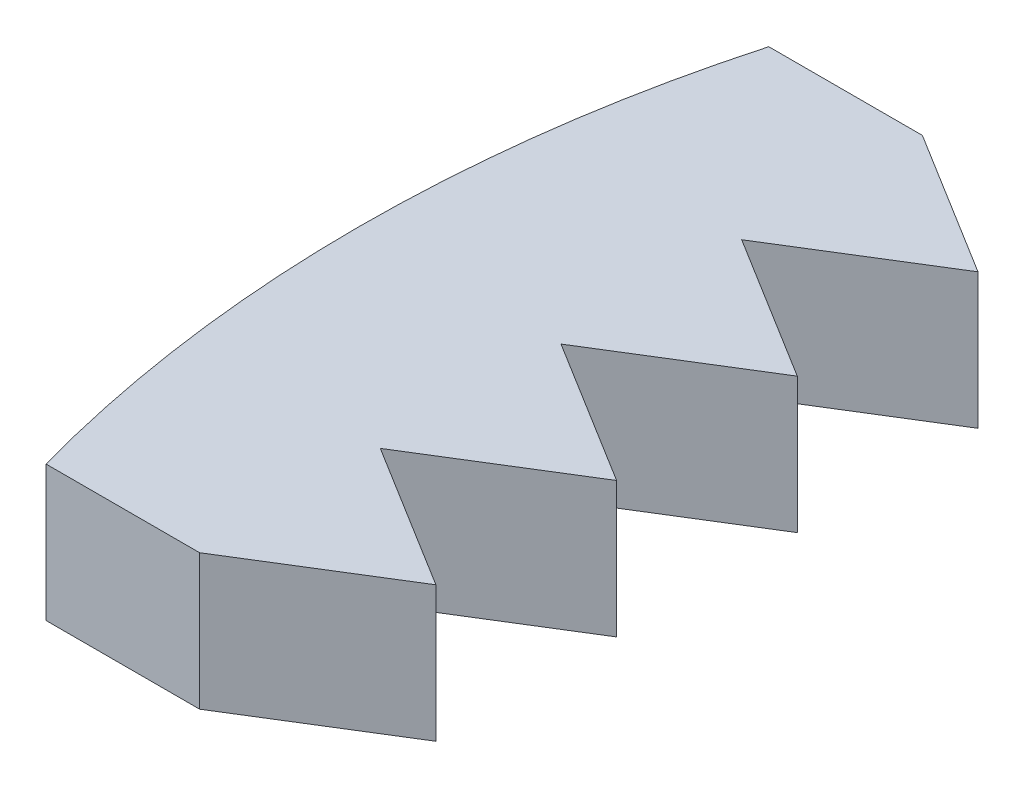
ISO-10303-21;
HEADER;
FILE_DESCRIPTION(('STEP AP214'),'2;1');
FILE_NAME('part.step','',(''),(''),'','','');
FILE_SCHEMA(('AUTOMOTIVE_DESIGN { 1 0 10303 214 1 1 1 1 }'));
ENDSEC;
DATA;
#1=APPLICATION_CONTEXT('core data for automotive mechanical design processes');
#2=APPLICATION_PROTOCOL_DEFINITION('international standard','automotive_design',2000,#1);
#3=PRODUCT_CONTEXT('',#1,'mechanical');
#4=PRODUCT('Part','Part','',(#3));
#5=PRODUCT_RELATED_PRODUCT_CATEGORY('part','',(#4));
#6=PRODUCT_DEFINITION_FORMATION('','',#4);
#7=PRODUCT_DEFINITION_CONTEXT('part definition',#1,'design');
#8=PRODUCT_DEFINITION('design','',#6,#7);
#9=PRODUCT_DEFINITION_SHAPE('','',#8);
#10=(LENGTH_UNIT() NAMED_UNIT(*) SI_UNIT(.MILLI.,.METRE.));
#11=(NAMED_UNIT(*) PLANE_ANGLE_UNIT() SI_UNIT($,.RADIAN.));
#12=(NAMED_UNIT(*) SI_UNIT($,.STERADIAN.) SOLID_ANGLE_UNIT());
#13=UNCERTAINTY_MEASURE_WITH_UNIT(LENGTH_MEASURE(1.E-05),#10,'distance_accuracy_value','');
#14=(GEOMETRIC_REPRESENTATION_CONTEXT(3) GLOBAL_UNCERTAINTY_ASSIGNED_CONTEXT((#13)) GLOBAL_UNIT_ASSIGNED_CONTEXT((#10,
#11,#12)) REPRESENTATION_CONTEXT('',''));
#15=CARTESIAN_POINT('',(0.,0.,0.));
#16=DIRECTION('',(0.,0.,1.));
#17=DIRECTION('',(1.,0.,0.));
#18=AXIS2_PLACEMENT_3D('',#15,#16,#17);
#19=CARTESIAN_POINT('',(-35.1117427625433,3.81,-27.5601803722913));
#20=DIRECTION('',(0.,0.,1.));
#21=DIRECTION('',(1.,0.,0.));
#22=AXIS2_PLACEMENT_3D('',#19,#20,#21);
#23=PLANE('',#22);
#24=DIRECTION('',(-1.,0.,0.));
#25=VECTOR('',#24,1.);
#26=CARTESIAN_POINT('',(-35.1117427625433,0.,-27.5601803722913));
#27=LINE('',#26,#25);
#28=CARTESIAN_POINT('',(-30.7937427625433,0.,-27.5601803722913));
#29=VERTEX_POINT('',#28);
#30=CARTESIAN_POINT('',(-35.1117427625433,0.,-27.5601803722913));
#31=VERTEX_POINT('',#30);
#32=EDGE_CURVE('E154',#29,#31,#27,.T.);
#33=ORIENTED_EDGE('',*,*,#32,.T.);
#34=DIRECTION('',(0.,-1.,0.));
#35=VECTOR('',#34,1.);
#36=CARTESIAN_POINT('',(-35.1117427625433,3.81,-27.5601803722913));
#37=LINE('',#36,#35);
#38=CARTESIAN_POINT('',(-35.1117427625433,3.81,-27.5601803722913));
#39=VERTEX_POINT('',#38);
#40=EDGE_CURVE('E11',#39,#31,#37,.T.);
#41=ORIENTED_EDGE('',*,*,#40,.F.);
#42=DIRECTION('',(-1.,0.,0.));
#43=VECTOR('',#42,1.);
#44=CARTESIAN_POINT('',(-35.1117427625433,3.81,-27.5601803722913));
#45=LINE('',#44,#43);
#46=CARTESIAN_POINT('',(-30.7937427625433,3.81,-27.5601803722913));
#47=VERTEX_POINT('',#46);
#48=EDGE_CURVE('E171',#47,#39,#45,.T.);
#49=ORIENTED_EDGE('',*,*,#48,.F.);
#50=DIRECTION('',(0.,-1.,0.));
#51=VECTOR('',#50,1.);
#52=CARTESIAN_POINT('',(-30.7937427625433,3.81,-27.5601803722913));
#53=LINE('',#52,#51);
#54=EDGE_CURVE('E146',#47,#29,#53,.T.);
#55=ORIENTED_EDGE('',*,*,#54,.T.);
#56=EDGE_LOOP('',(#33,#41,#49,#55));
#57=FACE_BOUND('',#56,.T.);
#58=ADVANCED_FACE('F39',(#57),#23,.F.);
#59=CARTESIAN_POINT('',(1.60861126625118,3.81,-17.4001803722913));
#60=DIRECTION('',(0.,-1.,0.));
#61=DIRECTION('',(0.,0.,-1.));
#62=AXIS2_PLACEMENT_3D('',#59,#60,#61);
#63=CYLINDRICAL_SURFACE('',#62,38.1);
#64=CARTESIAN_POINT('',(1.60861126625118,0.,-17.4001803722913));
#65=DIRECTION('',(0.,1.,0.));
#66=DIRECTION('',(0.,0.,1.));
#67=AXIS2_PLACEMENT_3D('',#64,#65,#66);
#68=CIRCLE('',#67,38.1);
#69=CARTESIAN_POINT('',(-35.1117427625433,0.,-7.24018037229127));
#70=VERTEX_POINT('',#69);
#71=EDGE_CURVE('E157',#31,#70,#68,.T.);
#72=ORIENTED_EDGE('',*,*,#71,.T.);
#73=DIRECTION('',(0.,-1.,0.));
#74=VECTOR('',#73,1.);
#75=CARTESIAN_POINT('',(-35.1117427625433,3.81,-7.24018037229127));
#76=LINE('',#75,#74);
#77=CARTESIAN_POINT('',(-35.1117427625433,3.81,-7.24018037229127));
#78=VERTEX_POINT('',#77);
#79=EDGE_CURVE('E50',#78,#70,#76,.T.);
#80=ORIENTED_EDGE('',*,*,#79,.F.);
#81=CARTESIAN_POINT('',(1.60861126625118,3.81,-17.4001803722913));
#82=DIRECTION('',(0.,1.,0.));
#83=DIRECTION('',(0.,0.,1.));
#84=AXIS2_PLACEMENT_3D('',#81,#82,#83);
#85=CIRCLE('',#84,38.1);
#86=EDGE_CURVE('E107',#39,#78,#85,.T.);
#87=ORIENTED_EDGE('',*,*,#86,.F.);
#88=ORIENTED_EDGE('',*,*,#40,.T.);
#89=EDGE_LOOP('',(#72,#80,#87,#88));
#90=FACE_BOUND('',#89,.T.);
#91=ADVANCED_FACE('F245',(#90),#63,.T.);
#92=CARTESIAN_POINT('',(-30.7937427625433,3.81,-7.24018037229128));
#93=DIRECTION('',(0.,0.,-1.));
#94=DIRECTION('',(-1.,0.,0.));
#95=AXIS2_PLACEMENT_3D('',#92,#93,#94);
#96=PLANE('',#95);
#97=DIRECTION('',(1.,0.,0.));
#98=VECTOR('',#97,1.);
#99=CARTESIAN_POINT('',(-30.7937427625433,0.,-7.24018037229128));
#100=LINE('',#99,#98);
#101=CARTESIAN_POINT('',(-30.7937427625433,0.,-7.24018037229128));
#102=VERTEX_POINT('',#101);
#103=EDGE_CURVE('E156',#70,#102,#100,.T.);
#104=ORIENTED_EDGE('',*,*,#103,.T.);
#105=DIRECTION('',(0.,-1.,0.));
#106=VECTOR('',#105,1.);
#107=CARTESIAN_POINT('',(-30.7937427625433,3.81,-7.24018037229128));
#108=LINE('',#107,#106);
#109=CARTESIAN_POINT('',(-30.7937427625433,3.81,-7.24018037229128));
#110=VERTEX_POINT('',#109);
#111=EDGE_CURVE('E188',#110,#102,#108,.T.);
#112=ORIENTED_EDGE('',*,*,#111,.F.);
#113=DIRECTION('',(1.,0.,0.));
#114=VECTOR('',#113,1.);
#115=CARTESIAN_POINT('',(-30.7937427625433,3.81,-7.24018037229128));
#116=LINE('',#115,#114);
#117=EDGE_CURVE('E197',#78,#110,#116,.T.);
#118=ORIENTED_EDGE('',*,*,#117,.F.);
#119=ORIENTED_EDGE('',*,*,#79,.T.);
#120=EDGE_LOOP('',(#104,#112,#118,#119));
#121=FACE_BOUND('',#120,.T.);
#122=ADVANCED_FACE('F193',(#121),#96,.F.);
#123=CARTESIAN_POINT('',(-26.6902471795068,3.81,-9.78018037229128));
#124=DIRECTION('',(-0.526315789473684,0.,-0.850289180073869));
#125=DIRECTION('',(-0.850289180073869,0.,0.526315789473684));
#126=AXIS2_PLACEMENT_3D('',#123,#124,#125);
#127=PLANE('',#126);
#128=DIRECTION('',(0.850289180073869,0.,-0.526315789473684));
#129=VECTOR('',#128,1.);
#130=CARTESIAN_POINT('',(-26.6902471795068,0.,-9.78018037229128));
#131=LINE('',#130,#129);
#132=CARTESIAN_POINT('',(-26.6902471795068,0.,-9.78018037229128));
#133=VERTEX_POINT('',#132);
#134=EDGE_CURVE('E158',#102,#133,#131,.T.);
#135=ORIENTED_EDGE('',*,*,#134,.T.);
#136=DIRECTION('',(0.,-1.,0.));
#137=VECTOR('',#136,1.);
#138=CARTESIAN_POINT('',(-26.6902471795068,3.81,-9.78018037229128));
#139=LINE('',#138,#137);
#140=CARTESIAN_POINT('',(-26.6902471795068,3.81,-9.78018037229128));
#141=VERTEX_POINT('',#140);
#142=EDGE_CURVE('E186',#141,#133,#139,.T.);
#143=ORIENTED_EDGE('',*,*,#142,.F.);
#144=DIRECTION('',(0.850289180073869,0.,-0.526315789473684));
#145=VECTOR('',#144,1.);
#146=CARTESIAN_POINT('',(-26.6902471795068,3.81,-9.78018037229128));
#147=LINE('',#146,#145);
#148=EDGE_CURVE('E214',#110,#141,#147,.T.);
#149=ORIENTED_EDGE('',*,*,#148,.F.);
#150=ORIENTED_EDGE('',*,*,#111,.T.);
#151=EDGE_LOOP('',(#135,#143,#149,#150));
#152=FACE_BOUND('',#151,.T.);
#153=ADVANCED_FACE('F206',(#152),#127,.F.);
#154=CARTESIAN_POINT('',(-30.7937427625433,3.81,-12.3201803722913));
#155=DIRECTION('',(-0.526315789473684,0.,0.850289180073869));
#156=DIRECTION('',(0.850289180073869,0.,0.526315789473684));
#157=AXIS2_PLACEMENT_3D('',#154,#155,#156);
#158=PLANE('',#157);
#159=DIRECTION('',(-0.850289180073869,0.,-0.526315789473684));
#160=VECTOR('',#159,1.);
#161=CARTESIAN_POINT('',(-30.7937427625433,0.,-12.3201803722913));
#162=LINE('',#161,#160);
#163=CARTESIAN_POINT('',(-30.7937427625433,0.,-12.3201803722913));
#164=VERTEX_POINT('',#163);
#165=EDGE_CURVE('E162',#133,#164,#162,.T.);
#166=ORIENTED_EDGE('',*,*,#165,.T.);
#167=DIRECTION('',(0.,-1.,0.));
#168=VECTOR('',#167,1.);
#169=CARTESIAN_POINT('',(-30.7937427625433,3.81,-12.3201803722913));
#170=LINE('',#169,#168);
#171=CARTESIAN_POINT('',(-30.7937427625433,3.81,-12.3201803722913));
#172=VERTEX_POINT('',#171);
#173=EDGE_CURVE('E183',#172,#164,#170,.T.);
#174=ORIENTED_EDGE('',*,*,#173,.F.);
#175=DIRECTION('',(-0.850289180073869,0.,-0.526315789473684));
#176=VECTOR('',#175,1.);
#177=CARTESIAN_POINT('',(-30.7937427625433,3.81,-12.3201803722913));
#178=LINE('',#177,#176);
#179=EDGE_CURVE('E212',#141,#172,#178,.T.);
#180=ORIENTED_EDGE('',*,*,#179,.F.);
#181=ORIENTED_EDGE('',*,*,#142,.T.);
#182=EDGE_LOOP('',(#166,#174,#180,#181));
#183=FACE_BOUND('',#182,.T.);
#184=ADVANCED_FACE('F210',(#183),#158,.F.);
#185=CARTESIAN_POINT('',(-26.6902471795068,3.81,-14.8601803722913));
#186=DIRECTION('',(-0.526315789473684,0.,-0.850289180073869));
#187=DIRECTION('',(-0.850289180073869,0.,0.526315789473684));
#188=AXIS2_PLACEMENT_3D('',#185,#186,#187);
#189=PLANE('',#188);
#190=DIRECTION('',(0.850289180073869,0.,-0.526315789473684));
#191=VECTOR('',#190,1.);
#192=CARTESIAN_POINT('',(-26.6902471795068,0.,-14.8601803722913));
#193=LINE('',#192,#191);
#194=CARTESIAN_POINT('',(-26.6902471795068,0.,-14.8601803722913));
#195=VERTEX_POINT('',#194);
#196=EDGE_CURVE('E163',#164,#195,#193,.T.);
#197=ORIENTED_EDGE('',*,*,#196,.T.);
#198=DIRECTION('',(0.,-1.,0.));
#199=VECTOR('',#198,1.);
#200=CARTESIAN_POINT('',(-26.6902471795068,3.81,-14.8601803722913));
#201=LINE('',#200,#199);
#202=CARTESIAN_POINT('',(-26.6902471795068,3.81,-14.8601803722913));
#203=VERTEX_POINT('',#202);
#204=EDGE_CURVE('E179',#203,#195,#201,.T.);
#205=ORIENTED_EDGE('',*,*,#204,.F.);
#206=DIRECTION('',(0.850289180073869,0.,-0.526315789473684));
#207=VECTOR('',#206,1.);
#208=CARTESIAN_POINT('',(-26.6902471795068,3.81,-14.8601803722913));
#209=LINE('',#208,#207);
#210=EDGE_CURVE('E215',#172,#203,#209,.T.);
#211=ORIENTED_EDGE('',*,*,#210,.F.);
#212=ORIENTED_EDGE('',*,*,#173,.T.);
#213=EDGE_LOOP('',(#197,#205,#211,#212));
#214=FACE_BOUND('',#213,.T.);
#215=ADVANCED_FACE('F256',(#214),#189,.F.);
#216=CARTESIAN_POINT('',(-30.7937427625433,3.81,-17.4001803722913));
#217=DIRECTION('',(-0.526315789473684,0.,0.850289180073869));
#218=DIRECTION('',(0.850289180073869,0.,0.526315789473684));
#219=AXIS2_PLACEMENT_3D('',#216,#217,#218);
#220=PLANE('',#219);
#221=DIRECTION('',(-0.850289180073869,0.,-0.526315789473684));
#222=VECTOR('',#221,1.);
#223=CARTESIAN_POINT('',(-30.7937427625433,0.,-17.4001803722913));
#224=LINE('',#223,#222);
#225=CARTESIAN_POINT('',(-30.7937427625433,0.,-17.4001803722913));
#226=VERTEX_POINT('',#225);
#227=EDGE_CURVE('E168',#195,#226,#224,.T.);
#228=ORIENTED_EDGE('',*,*,#227,.T.);
#229=DIRECTION('',(0.,-1.,0.));
#230=VECTOR('',#229,1.);
#231=CARTESIAN_POINT('',(-30.7937427625433,3.81,-17.4001803722913));
#232=LINE('',#231,#230);
#233=CARTESIAN_POINT('',(-30.7937427625433,3.81,-17.4001803722913));
#234=VERTEX_POINT('',#233);
#235=EDGE_CURVE('E180',#234,#226,#232,.T.);
#236=ORIENTED_EDGE('',*,*,#235,.F.);
#237=DIRECTION('',(-0.850289180073869,0.,-0.526315789473684));
#238=VECTOR('',#237,1.);
#239=CARTESIAN_POINT('',(-30.7937427625433,3.81,-17.4001803722913));
#240=LINE('',#239,#238);
#241=EDGE_CURVE('E220',#203,#234,#240,.T.);
#242=ORIENTED_EDGE('',*,*,#241,.F.);
#243=ORIENTED_EDGE('',*,*,#204,.T.);
#244=EDGE_LOOP('',(#228,#236,#242,#243));
#245=FACE_BOUND('',#244,.T.);
#246=ADVANCED_FACE('F226',(#245),#220,.F.);
#247=CARTESIAN_POINT('',(-26.6902471795068,3.81,-19.9401803722913));
#248=DIRECTION('',(-0.526315789473684,0.,-0.850289180073869));
#249=DIRECTION('',(-0.850289180073869,0.,0.526315789473684));
#250=AXIS2_PLACEMENT_3D('',#247,#248,#249);
#251=PLANE('',#250);
#252=DIRECTION('',(0.850289180073869,0.,-0.526315789473684));
#253=VECTOR('',#252,1.);
#254=CARTESIAN_POINT('',(-26.6902471795068,0.,-19.9401803722913));
#255=LINE('',#254,#253);
#256=CARTESIAN_POINT('',(-26.6902471795068,0.,-19.9401803722913));
#257=VERTEX_POINT('',#256);
#258=EDGE_CURVE('E166',#226,#257,#255,.T.);
#259=ORIENTED_EDGE('',*,*,#258,.T.);
#260=DIRECTION('',(0.,-1.,0.));
#261=VECTOR('',#260,1.);
#262=CARTESIAN_POINT('',(-26.6902471795068,3.81,-19.9401803722913));
#263=LINE('',#262,#261);
#264=CARTESIAN_POINT('',(-26.6902471795068,3.81,-19.9401803722913));
#265=VERTEX_POINT('',#264);
#266=EDGE_CURVE('E143',#265,#257,#263,.T.);
#267=ORIENTED_EDGE('',*,*,#266,.F.);
#268=DIRECTION('',(0.850289180073869,0.,-0.526315789473684));
#269=VECTOR('',#268,1.);
#270=CARTESIAN_POINT('',(-26.6902471795068,3.81,-19.9401803722913));
#271=LINE('',#270,#269);
#272=EDGE_CURVE('E134',#234,#265,#271,.T.);
#273=ORIENTED_EDGE('',*,*,#272,.F.);
#274=ORIENTED_EDGE('',*,*,#235,.T.);
#275=EDGE_LOOP('',(#259,#267,#273,#274));
#276=FACE_BOUND('',#275,.T.);
#277=ADVANCED_FACE('F229',(#276),#251,.F.);
#278=CARTESIAN_POINT('',(-30.7937427625433,3.81,-22.4801803722913));
#279=DIRECTION('',(-0.526315789473684,0.,0.850289180073869));
#280=DIRECTION('',(0.850289180073869,0.,0.526315789473684));
#281=AXIS2_PLACEMENT_3D('',#278,#279,#280);
#282=PLANE('',#281);
#283=DIRECTION('',(-0.850289180073869,0.,-0.526315789473684));
#284=VECTOR('',#283,1.);
#285=CARTESIAN_POINT('',(-30.7937427625433,0.,-22.4801803722913));
#286=LINE('',#285,#284);
#287=CARTESIAN_POINT('',(-30.7937427625433,0.,-22.4801803722913));
#288=VERTEX_POINT('',#287);
#289=EDGE_CURVE('E142',#257,#288,#286,.T.);
#290=ORIENTED_EDGE('',*,*,#289,.T.);
#291=DIRECTION('',(0.,-1.,0.));
#292=VECTOR('',#291,1.);
#293=CARTESIAN_POINT('',(-30.7937427625433,3.81,-22.4801803722913));
#294=LINE('',#293,#292);
#295=CARTESIAN_POINT('',(-30.7937427625433,3.81,-22.4801803722913));
#296=VERTEX_POINT('',#295);
#297=EDGE_CURVE('E139',#296,#288,#294,.T.);
#298=ORIENTED_EDGE('',*,*,#297,.F.);
#299=DIRECTION('',(-0.850289180073869,0.,-0.526315789473684));
#300=VECTOR('',#299,1.);
#301=CARTESIAN_POINT('',(-30.7937427625433,3.81,-22.4801803722913));
#302=LINE('',#301,#300);
#303=EDGE_CURVE('E129',#265,#296,#302,.T.);
#304=ORIENTED_EDGE('',*,*,#303,.F.);
#305=ORIENTED_EDGE('',*,*,#266,.T.);
#306=EDGE_LOOP('',(#290,#298,#304,#305));
#307=FACE_BOUND('',#306,.T.);
#308=ADVANCED_FACE('F141',(#307),#282,.F.);
#309=CARTESIAN_POINT('',(-26.6902471795068,3.81,-25.0201803722913));
#310=DIRECTION('',(-0.526315789473684,0.,-0.850289180073869));
#311=DIRECTION('',(-0.850289180073869,0.,0.526315789473684));
#312=AXIS2_PLACEMENT_3D('',#309,#310,#311);
#313=PLANE('',#312);
#314=DIRECTION('',(0.850289180073869,0.,-0.526315789473684));
#315=VECTOR('',#314,1.);
#316=CARTESIAN_POINT('',(-26.6902471795068,0.,-25.0201803722913));
#317=LINE('',#316,#315);
#318=CARTESIAN_POINT('',(-26.6902471795068,0.,-25.0201803722913));
#319=VERTEX_POINT('',#318);
#320=EDGE_CURVE('E93',#288,#319,#317,.T.);
#321=ORIENTED_EDGE('',*,*,#320,.T.);
#322=DIRECTION('',(0.,-1.,0.));
#323=VECTOR('',#322,1.);
#324=CARTESIAN_POINT('',(-26.6902471795068,3.81,-25.0201803722913));
#325=LINE('',#324,#323);
#326=CARTESIAN_POINT('',(-26.6902471795068,3.81,-25.0201803722913));
#327=VERTEX_POINT('',#326);
#328=EDGE_CURVE('E144',#327,#319,#325,.T.);
#329=ORIENTED_EDGE('',*,*,#328,.F.);
#330=DIRECTION('',(0.850289180073869,0.,-0.526315789473684));
#331=VECTOR('',#330,1.);
#332=CARTESIAN_POINT('',(-26.6902471795068,3.81,-25.0201803722913));
#333=LINE('',#332,#331);
#334=EDGE_CURVE('E133',#296,#327,#333,.T.);
#335=ORIENTED_EDGE('',*,*,#334,.F.);
#336=ORIENTED_EDGE('',*,*,#297,.T.);
#337=EDGE_LOOP('',(#321,#329,#335,#336));
#338=FACE_BOUND('',#337,.T.);
#339=ADVANCED_FACE('F150',(#338),#313,.F.);
#340=CARTESIAN_POINT('',(-30.7937427625433,3.81,-27.5601803722913));
#341=DIRECTION('',(-0.526315789473684,0.,0.850289180073869));
#342=DIRECTION('',(0.850289180073869,0.,0.526315789473684));
#343=AXIS2_PLACEMENT_3D('',#340,#341,#342);
#344=PLANE('',#343);
#345=DIRECTION('',(-0.850289180073869,0.,-0.526315789473684));
#346=VECTOR('',#345,1.);
#347=CARTESIAN_POINT('',(-30.7937427625433,0.,-27.5601803722913));
#348=LINE('',#347,#346);
#349=EDGE_CURVE('E98',#319,#29,#348,.T.);
#350=ORIENTED_EDGE('',*,*,#349,.T.);
#351=ORIENTED_EDGE('',*,*,#54,.F.);
#352=DIRECTION('',(-0.850289180073869,0.,-0.526315789473684));
#353=VECTOR('',#352,1.);
#354=CARTESIAN_POINT('',(-30.7937427625433,3.81,-27.5601803722913));
#355=LINE('',#354,#353);
#356=EDGE_CURVE('E54',#327,#47,#355,.T.);
#357=ORIENTED_EDGE('',*,*,#356,.F.);
#358=ORIENTED_EDGE('',*,*,#328,.T.);
#359=EDGE_LOOP('',(#350,#351,#357,#358));
#360=FACE_BOUND('',#359,.T.);
#361=ADVANCED_FACE('F233',(#360),#344,.F.);
#362=CARTESIAN_POINT('',(1.60861126625118,3.81,-17.4001803722913));
#363=DIRECTION('',(0.,1.,0.));
#364=DIRECTION('',(0.,0.,1.));
#365=AXIS2_PLACEMENT_3D('',#362,#363,#364);
#366=PLANE('',#365);
#367=ORIENTED_EDGE('',*,*,#48,.T.);
#368=ORIENTED_EDGE('',*,*,#86,.T.);
#369=ORIENTED_EDGE('',*,*,#117,.T.);
#370=ORIENTED_EDGE('',*,*,#148,.T.);
#371=ORIENTED_EDGE('',*,*,#179,.T.);
#372=ORIENTED_EDGE('',*,*,#210,.T.);
#373=ORIENTED_EDGE('',*,*,#241,.T.);
#374=ORIENTED_EDGE('',*,*,#272,.T.);
#375=ORIENTED_EDGE('',*,*,#303,.T.);
#376=ORIENTED_EDGE('',*,*,#334,.T.);
#377=ORIENTED_EDGE('',*,*,#356,.T.);
#378=EDGE_LOOP('',(#367,#368,#369,#370,#371,#372,#373,#374,#375,#376,#377));
#379=FACE_BOUND('',#378,.T.);
#380=ADVANCED_FACE('F131',(#379),#366,.T.);
#381=CARTESIAN_POINT('',(1.60861126625118,0.,-17.4001803722913));
#382=DIRECTION('',(0.,1.,0.));
#383=DIRECTION('',(0.,0.,1.));
#384=AXIS2_PLACEMENT_3D('',#381,#382,#383);
#385=PLANE('',#384);
#386=ORIENTED_EDGE('',*,*,#32,.F.);
#387=ORIENTED_EDGE('',*,*,#349,.F.);
#388=ORIENTED_EDGE('',*,*,#320,.F.);
#389=ORIENTED_EDGE('',*,*,#289,.F.);
#390=ORIENTED_EDGE('',*,*,#258,.F.);
#391=ORIENTED_EDGE('',*,*,#227,.F.);
#392=ORIENTED_EDGE('',*,*,#196,.F.);
#393=ORIENTED_EDGE('',*,*,#165,.F.);
#394=ORIENTED_EDGE('',*,*,#134,.F.);
#395=ORIENTED_EDGE('',*,*,#103,.F.);
#396=ORIENTED_EDGE('',*,*,#71,.F.);
#397=EDGE_LOOP('',(#386,#387,#388,#389,#390,#391,#392,#393,#394,#395,#396));
#398=FACE_BOUND('',#397,.T.);
#399=ADVANCED_FACE('F202',(#398),#385,.F.);
#400=CLOSED_SHELL('',(#58,#91,#122,#153,#184,#215,#246,#277,#308,#339,#361,#380,#399));
#401=MANIFOLD_SOLID_BREP('B2',#400);
#402=ADVANCED_BREP_SHAPE_REPRESENTATION('',(#18,#401),#14);
#403=SHAPE_DEFINITION_REPRESENTATION(#9,#402);
ENDSEC;
END-ISO-10303-21;
